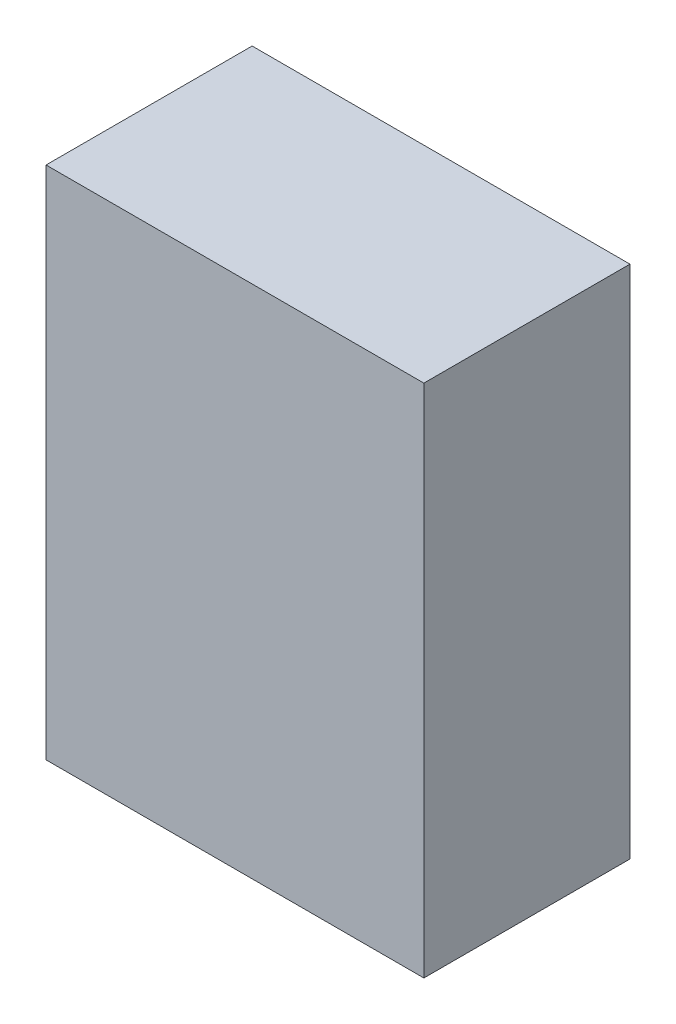
ISO-10303-21;
HEADER;
FILE_DESCRIPTION(('STEP AP214'),'2;1');
FILE_NAME('part.step','',(''),(''),'','','');
FILE_SCHEMA(('AUTOMOTIVE_DESIGN { 1 0 10303 214 1 1 1 1 }'));
ENDSEC;
DATA;
#1=APPLICATION_CONTEXT('core data for automotive mechanical design processes');
#2=APPLICATION_PROTOCOL_DEFINITION('international standard','automotive_design',2000,#1);
#3=PRODUCT_CONTEXT('',#1,'mechanical');
#4=PRODUCT('Part','Part','',(#3));
#5=PRODUCT_RELATED_PRODUCT_CATEGORY('part','',(#4));
#6=PRODUCT_DEFINITION_FORMATION('','',#4);
#7=PRODUCT_DEFINITION_CONTEXT('part definition',#1,'design');
#8=PRODUCT_DEFINITION('design','',#6,#7);
#9=PRODUCT_DEFINITION_SHAPE('','',#8);
#10=(LENGTH_UNIT() NAMED_UNIT(*) SI_UNIT(.MILLI.,.METRE.));
#11=(NAMED_UNIT(*) PLANE_ANGLE_UNIT() SI_UNIT($,.RADIAN.));
#12=(NAMED_UNIT(*) SI_UNIT($,.STERADIAN.) SOLID_ANGLE_UNIT());
#13=UNCERTAINTY_MEASURE_WITH_UNIT(LENGTH_MEASURE(1.E-05),#10,'distance_accuracy_value','');
#14=(GEOMETRIC_REPRESENTATION_CONTEXT(3) GLOBAL_UNCERTAINTY_ASSIGNED_CONTEXT((#13)) GLOBAL_UNIT_ASSIGNED_CONTEXT((#10,
#11,#12)) REPRESENTATION_CONTEXT('',''));
#15=CARTESIAN_POINT('',(0.,0.,0.));
#16=DIRECTION('',(0.,0.,1.));
#17=DIRECTION('',(1.,0.,0.));
#18=AXIS2_PLACEMENT_3D('',#15,#16,#17);
#19=CARTESIAN_POINT('',(0.,30.,0.));
#20=DIRECTION('',(1.,0.,0.));
#21=DIRECTION('',(0.,0.,-1.));
#22=AXIS2_PLACEMENT_3D('',#19,#20,#21);
#23=PLANE('',#22);
#24=DIRECTION('',(0.,0.,1.));
#25=VECTOR('',#24,1.);
#26=CARTESIAN_POINT('',(0.,0.,0.));
#27=LINE('',#26,#25);
#28=CARTESIAN_POINT('',(0.,0.,-12.));
#29=VERTEX_POINT('',#28);
#30=CARTESIAN_POINT('',(0.,0.,0.));
#31=VERTEX_POINT('',#30);
#32=EDGE_CURVE('E100',#29,#31,#27,.T.);
#33=ORIENTED_EDGE('',*,*,#32,.T.);
#34=DIRECTION('',(0.,-1.,0.));
#35=VECTOR('',#34,1.);
#36=CARTESIAN_POINT('',(0.,30.,0.));
#37=LINE('',#36,#35);
#38=CARTESIAN_POINT('',(0.,30.,0.));
#39=VERTEX_POINT('',#38);
#40=EDGE_CURVE('E11',#39,#31,#37,.T.);
#41=ORIENTED_EDGE('',*,*,#40,.F.);
#42=DIRECTION('',(0.,0.,1.));
#43=VECTOR('',#42,1.);
#44=CARTESIAN_POINT('',(0.,30.,0.));
#45=LINE('',#44,#43);
#46=CARTESIAN_POINT('',(0.,30.,-12.));
#47=VERTEX_POINT('',#46);
#48=EDGE_CURVE('E88',#47,#39,#45,.T.);
#49=ORIENTED_EDGE('',*,*,#48,.F.);
#50=DIRECTION('',(0.,-1.,0.));
#51=VECTOR('',#50,1.);
#52=CARTESIAN_POINT('',(0.,30.,-12.));
#53=LINE('',#52,#51);
#54=EDGE_CURVE('E96',#47,#29,#53,.T.);
#55=ORIENTED_EDGE('',*,*,#54,.T.);
#56=EDGE_LOOP('',(#33,#41,#49,#55));
#57=FACE_BOUND('',#56,.T.);
#58=ADVANCED_FACE('F37',(#57),#23,.F.);
#59=CARTESIAN_POINT('',(0.,30.,0.));
#60=DIRECTION('',(0.,0.,-1.));
#61=DIRECTION('',(-1.,0.,0.));
#62=AXIS2_PLACEMENT_3D('',#59,#60,#61);
#63=PLANE('',#62);
#64=DIRECTION('',(1.,0.,0.));
#65=VECTOR('',#64,1.);
#66=CARTESIAN_POINT('',(0.,0.,0.));
#67=LINE('',#66,#65);
#68=CARTESIAN_POINT('',(22.,0.,0.));
#69=VERTEX_POINT('',#68);
#70=EDGE_CURVE('E92',#31,#69,#67,.T.);
#71=ORIENTED_EDGE('',*,*,#70,.T.);
#72=DIRECTION('',(0.,-1.,0.));
#73=VECTOR('',#72,1.);
#74=CARTESIAN_POINT('',(22.,30.,0.));
#75=LINE('',#74,#73);
#76=CARTESIAN_POINT('',(22.,30.,0.));
#77=VERTEX_POINT('',#76);
#78=EDGE_CURVE('E45',#77,#69,#75,.T.);
#79=ORIENTED_EDGE('',*,*,#78,.F.);
#80=DIRECTION('',(1.,0.,0.));
#81=VECTOR('',#80,1.);
#82=CARTESIAN_POINT('',(0.,30.,0.));
#83=LINE('',#82,#81);
#84=EDGE_CURVE('E83',#39,#77,#83,.T.);
#85=ORIENTED_EDGE('',*,*,#84,.F.);
#86=ORIENTED_EDGE('',*,*,#40,.T.);
#87=EDGE_LOOP('',(#71,#79,#85,#86));
#88=FACE_BOUND('',#87,.T.);
#89=ADVANCED_FACE('F91',(#88),#63,.F.);
#90=CARTESIAN_POINT('',(22.,30.,0.));
#91=DIRECTION('',(-1.,0.,0.));
#92=DIRECTION('',(0.,0.,1.));
#93=AXIS2_PLACEMENT_3D('',#90,#91,#92);
#94=PLANE('',#93);
#95=DIRECTION('',(0.,0.,-1.));
#96=VECTOR('',#95,1.);
#97=CARTESIAN_POINT('',(22.,0.,0.));
#98=LINE('',#97,#96);
#99=CARTESIAN_POINT('',(22.,0.,-12.));
#100=VERTEX_POINT('',#99);
#101=EDGE_CURVE('E70',#69,#100,#98,.T.);
#102=ORIENTED_EDGE('',*,*,#101,.T.);
#103=DIRECTION('',(0.,-1.,0.));
#104=VECTOR('',#103,1.);
#105=CARTESIAN_POINT('',(22.,30.,-12.));
#106=LINE('',#105,#104);
#107=CARTESIAN_POINT('',(22.,30.,-12.));
#108=VERTEX_POINT('',#107);
#109=EDGE_CURVE('E93',#108,#100,#106,.T.);
#110=ORIENTED_EDGE('',*,*,#109,.F.);
#111=DIRECTION('',(0.,0.,-1.));
#112=VECTOR('',#111,1.);
#113=CARTESIAN_POINT('',(22.,30.,0.));
#114=LINE('',#113,#112);
#115=EDGE_CURVE('E86',#77,#108,#114,.T.);
#116=ORIENTED_EDGE('',*,*,#115,.F.);
#117=ORIENTED_EDGE('',*,*,#78,.T.);
#118=EDGE_LOOP('',(#102,#110,#116,#117));
#119=FACE_BOUND('',#118,.T.);
#120=ADVANCED_FACE('F94',(#119),#94,.F.);
#121=CARTESIAN_POINT('',(0.,30.,-12.));
#122=DIRECTION('',(0.,0.,1.));
#123=DIRECTION('',(1.,0.,0.));
#124=AXIS2_PLACEMENT_3D('',#121,#122,#123);
#125=PLANE('',#124);
#126=DIRECTION('',(-1.,0.,0.));
#127=VECTOR('',#126,1.);
#128=CARTESIAN_POINT('',(0.,0.,-12.));
#129=LINE('',#128,#127);
#130=EDGE_CURVE('E76',#100,#29,#129,.T.);
#131=ORIENTED_EDGE('',*,*,#130,.T.);
#132=ORIENTED_EDGE('',*,*,#54,.F.);
#133=DIRECTION('',(-1.,0.,0.));
#134=VECTOR('',#133,1.);
#135=CARTESIAN_POINT('',(0.,30.,-12.));
#136=LINE('',#135,#134);
#137=EDGE_CURVE('E53',#108,#47,#136,.T.);
#138=ORIENTED_EDGE('',*,*,#137,.F.);
#139=ORIENTED_EDGE('',*,*,#109,.T.);
#140=EDGE_LOOP('',(#131,#132,#138,#139));
#141=FACE_BOUND('',#140,.T.);
#142=ADVANCED_FACE('F107',(#141),#125,.F.);
#143=CARTESIAN_POINT('',(0.,30.,0.));
#144=DIRECTION('',(0.,-1.,0.));
#145=DIRECTION('',(0.,0.,-1.));
#146=AXIS2_PLACEMENT_3D('',#143,#144,#145);
#147=PLANE('',#146);
#148=ORIENTED_EDGE('',*,*,#48,.T.);
#149=ORIENTED_EDGE('',*,*,#84,.T.);
#150=ORIENTED_EDGE('',*,*,#115,.T.);
#151=ORIENTED_EDGE('',*,*,#137,.T.);
#152=EDGE_LOOP('',(#148,#149,#150,#151));
#153=FACE_BOUND('',#152,.T.);
#154=ADVANCED_FACE('F84',(#153),#147,.F.);
#155=CARTESIAN_POINT('',(0.,0.,0.));
#156=DIRECTION('',(0.,-1.,0.));
#157=DIRECTION('',(0.,0.,-1.));
#158=AXIS2_PLACEMENT_3D('',#155,#156,#157);
#159=PLANE('',#158);
#160=ORIENTED_EDGE('',*,*,#32,.F.);
#161=ORIENTED_EDGE('',*,*,#130,.F.);
#162=ORIENTED_EDGE('',*,*,#101,.F.);
#163=ORIENTED_EDGE('',*,*,#70,.F.);
#164=EDGE_LOOP('',(#160,#161,#162,#163));
#165=FACE_BOUND('',#164,.T.);
#166=ADVANCED_FACE('F110',(#165),#159,.T.);
#167=CLOSED_SHELL('',(#58,#89,#120,#142,#154,#166));
#168=MANIFOLD_SOLID_BREP('B2',#167);
#169=ADVANCED_BREP_SHAPE_REPRESENTATION('',(#18,#168),#14);
#170=SHAPE_DEFINITION_REPRESENTATION(#9,#169);
ENDSEC;
END-ISO-10303-21;
